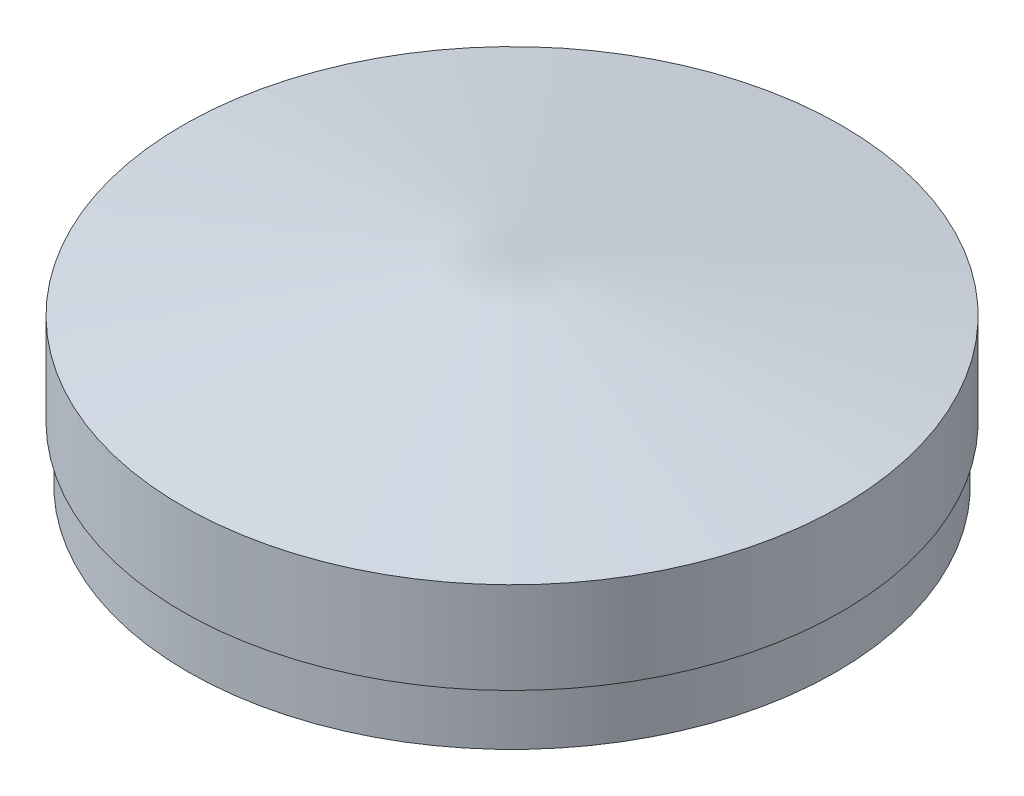
ISO-10303-21;
HEADER;
FILE_DESCRIPTION(('STEP AP214'),'2;1');
FILE_NAME('part.step','',(''),(''),'','','');
FILE_SCHEMA(('AUTOMOTIVE_DESIGN { 1 0 10303 214 1 1 1 1 }'));
ENDSEC;
DATA;
#1=APPLICATION_CONTEXT('core data for automotive mechanical design processes');
#2=APPLICATION_PROTOCOL_DEFINITION('international standard','automotive_design',2000,#1);
#3=PRODUCT_CONTEXT('',#1,'mechanical');
#4=PRODUCT('Part','Part','',(#3));
#5=PRODUCT_RELATED_PRODUCT_CATEGORY('part','',(#4));
#6=PRODUCT_DEFINITION_FORMATION('','',#4);
#7=PRODUCT_DEFINITION_CONTEXT('part definition',#1,'design');
#8=PRODUCT_DEFINITION('design','',#6,#7);
#9=PRODUCT_DEFINITION_SHAPE('','',#8);
#10=(LENGTH_UNIT() NAMED_UNIT(*) SI_UNIT(.MILLI.,.METRE.));
#11=(NAMED_UNIT(*) PLANE_ANGLE_UNIT() SI_UNIT($,.RADIAN.));
#12=(NAMED_UNIT(*) SI_UNIT($,.STERADIAN.) SOLID_ANGLE_UNIT());
#13=UNCERTAINTY_MEASURE_WITH_UNIT(LENGTH_MEASURE(1.E-05),#10,'distance_accuracy_value','');
#14=(GEOMETRIC_REPRESENTATION_CONTEXT(3) GLOBAL_UNCERTAINTY_ASSIGNED_CONTEXT((#13)) GLOBAL_UNIT_ASSIGNED_CONTEXT((#10,
#11,#12)) REPRESENTATION_CONTEXT('',''));
#15=CARTESIAN_POINT('',(0.,0.,0.));
#16=DIRECTION('',(0.,0.,1.));
#17=DIRECTION('',(1.,0.,0.));
#18=AXIS2_PLACEMENT_3D('',#15,#16,#17);
#19=CARTESIAN_POINT('',(0.,0.,0.));
#20=DIRECTION('',(0.,-1.,0.));
#21=DIRECTION('',(0.,0.,-1.));
#22=AXIS2_PLACEMENT_3D('',#19,#20,#21);
#23=CONICAL_SURFACE('',#22,18.,1.40564764938027);
#24=CARTESIAN_POINT('',(0.,3.,0.));
#25=VERTEX_POINT('',#24);
#26=VERTEX_LOOP('',#25);
#27=FACE_BOUND('',#26,.T.);
#28=CARTESIAN_POINT('',(0.,0.,0.));
#29=DIRECTION('',(0.,-1.,0.));
#30=DIRECTION('',(0.,0.,-1.));
#31=AXIS2_PLACEMENT_3D('',#28,#29,#30);
#32=CIRCLE('',#31,18.);
#33=CARTESIAN_POINT('',(0.,0.,-18.));
#34=VERTEX_POINT('',#33);
#35=EDGE_CURVE('E41',#34,#34,#32,.T.);
#36=ORIENTED_EDGE('',*,*,#35,.F.);
#37=EDGE_LOOP('',(#36));
#38=FACE_BOUND('',#37,.T.);
#39=ADVANCED_FACE('F35',(#27,#38),#23,.T.);
#40=CARTESIAN_POINT('',(0.,-5.,0.));
#41=DIRECTION('',(0.,1.,0.));
#42=DIRECTION('',(0.,0.,1.));
#43=AXIS2_PLACEMENT_3D('',#40,#41,#42);
#44=CYLINDRICAL_SURFACE('',#43,18.);
#45=CARTESIAN_POINT('',(0.,-5.,0.));
#46=DIRECTION('',(0.,-1.,0.));
#47=DIRECTION('',(0.,0.,-1.));
#48=AXIS2_PLACEMENT_3D('',#45,#46,#47);
#49=CIRCLE('',#48,18.);
#50=CARTESIAN_POINT('',(0.,-5.,-18.));
#51=VERTEX_POINT('',#50);
#52=EDGE_CURVE('E50',#51,#51,#49,.T.);
#53=ORIENTED_EDGE('',*,*,#52,.F.);
#54=EDGE_LOOP('',(#53));
#55=FACE_BOUND('',#54,.T.);
#56=ORIENTED_EDGE('',*,*,#35,.T.);
#57=EDGE_LOOP('',(#56));
#58=FACE_BOUND('',#57,.T.);
#59=ADVANCED_FACE('F46',(#55,#58),#44,.T.);
#60=CARTESIAN_POINT('',(0.,-5.,0.));
#61=DIRECTION('',(0.,-1.,0.));
#62=DIRECTION('',(0.,0.,-1.));
#63=AXIS2_PLACEMENT_3D('',#60,#61,#62);
#64=PLANE('',#63);
#65=CARTESIAN_POINT('',(0.,-5.,0.));
#66=DIRECTION('',(0.,-1.,0.));
#67=DIRECTION('',(0.,0.,-1.));
#68=AXIS2_PLACEMENT_3D('',#65,#66,#67);
#69=CIRCLE('',#68,17.7);
#70=CARTESIAN_POINT('',(0.,-5.,-17.7));
#71=VERTEX_POINT('',#70);
#72=EDGE_CURVE('E55',#71,#71,#69,.T.);
#73=ORIENTED_EDGE('',*,*,#72,.F.);
#74=EDGE_LOOP('',(#73));
#75=FACE_BOUND('',#74,.T.);
#76=ORIENTED_EDGE('',*,*,#52,.T.);
#77=EDGE_LOOP('',(#76));
#78=FACE_BOUND('',#77,.T.);
#79=ADVANCED_FACE('F104',(#75,#78),#64,.T.);
#80=CARTESIAN_POINT('',(0.,-8.,0.));
#81=DIRECTION('',(0.,-1.,0.));
#82=DIRECTION('',(0.,0.,-1.));
#83=AXIS2_PLACEMENT_3D('',#80,#81,#82);
#84=PLANE('',#83);
#85=CARTESIAN_POINT('',(0.,-8.,0.));
#86=DIRECTION('',(0.,-1.,0.));
#87=DIRECTION('',(0.,0.,-1.));
#88=AXIS2_PLACEMENT_3D('',#85,#86,#87);
#89=CIRCLE('',#88,17.7);
#90=CARTESIAN_POINT('',(0.,-8.,-17.7));
#91=VERTEX_POINT('',#90);
#92=EDGE_CURVE('E52',#91,#91,#89,.T.);
#93=ORIENTED_EDGE('',*,*,#92,.T.);
#94=EDGE_LOOP('',(#93));
#95=FACE_BOUND('',#94,.T.);
#96=CARTESIAN_POINT('',(0.,-8.,0.));
#97=DIRECTION('',(0.,-1.,0.));
#98=DIRECTION('',(0.,0.,-1.));
#99=AXIS2_PLACEMENT_3D('',#96,#97,#98);
#100=CIRCLE('',#99,16.7);
#101=CARTESIAN_POINT('',(0.,-8.,-16.7));
#102=VERTEX_POINT('',#101);
#103=EDGE_CURVE('E58',#102,#102,#100,.T.);
#104=ORIENTED_EDGE('',*,*,#103,.F.);
#105=EDGE_LOOP('',(#104));
#106=FACE_BOUND('',#105,.T.);
#107=ADVANCED_FACE('F101',(#95,#106),#84,.T.);
#108=CARTESIAN_POINT('',(0.,-8.,0.));
#109=DIRECTION('',(0.,1.,0.));
#110=DIRECTION('',(0.,0.,1.));
#111=AXIS2_PLACEMENT_3D('',#108,#109,#110);
#112=CYLINDRICAL_SURFACE('',#111,17.7);
#113=ORIENTED_EDGE('',*,*,#92,.F.);
#114=EDGE_LOOP('',(#113));
#115=FACE_BOUND('',#114,.T.);
#116=ORIENTED_EDGE('',*,*,#72,.T.);
#117=EDGE_LOOP('',(#116));
#118=FACE_BOUND('',#117,.T.);
#119=ADVANCED_FACE('F99',(#115,#118),#112,.T.);
#120=CARTESIAN_POINT('',(0.,-8.,0.));
#121=DIRECTION('',(0.,1.,0.));
#122=DIRECTION('',(0.,0.,1.));
#123=AXIS2_PLACEMENT_3D('',#120,#121,#122);
#124=CYLINDRICAL_SURFACE('',#123,16.7);
#125=ORIENTED_EDGE('',*,*,#103,.T.);
#126=EDGE_LOOP('',(#125));
#127=FACE_BOUND('',#126,.T.);
#128=CARTESIAN_POINT('',(0.,0.,0.));
#129=DIRECTION('',(0.,-1.,0.));
#130=DIRECTION('',(0.,0.,-1.));
#131=AXIS2_PLACEMENT_3D('',#128,#129,#130);
#132=CIRCLE('',#131,16.7);
#133=CARTESIAN_POINT('',(0.,0.,-16.7));
#134=VERTEX_POINT('',#133);
#135=EDGE_CURVE('E63',#134,#134,#132,.T.);
#136=ORIENTED_EDGE('',*,*,#135,.F.);
#137=EDGE_LOOP('',(#136));
#138=FACE_BOUND('',#137,.T.);
#139=ADVANCED_FACE('F91',(#127,#138),#124,.F.);
#140=CARTESIAN_POINT('',(0.,0.,0.));
#141=DIRECTION('',(0.,-1.,0.));
#142=DIRECTION('',(0.,0.,-1.));
#143=AXIS2_PLACEMENT_3D('',#140,#141,#142);
#144=PLANE('',#143);
#145=CARTESIAN_POINT('',(0.,0.,0.));
#146=DIRECTION('',(0.,-1.,0.));
#147=DIRECTION('',(0.,0.,-1.));
#148=AXIS2_PLACEMENT_3D('',#145,#146,#147);
#149=CIRCLE('',#148,2.5);
#150=CARTESIAN_POINT('',(0.,0.,-2.5));
#151=VERTEX_POINT('',#150);
#152=EDGE_CURVE('E67',#151,#151,#149,.T.);
#153=ORIENTED_EDGE('',*,*,#152,.F.);
#154=EDGE_LOOP('',(#153));
#155=FACE_BOUND('',#154,.T.);
#156=ORIENTED_EDGE('',*,*,#135,.T.);
#157=EDGE_LOOP('',(#156));
#158=FACE_BOUND('',#157,.T.);
#159=ADVANCED_FACE('F82',(#155,#158),#144,.T.);
#160=CARTESIAN_POINT('',(0.,-8.,0.));
#161=DIRECTION('',(0.,-1.,0.));
#162=DIRECTION('',(0.,0.,-1.));
#163=AXIS2_PLACEMENT_3D('',#160,#161,#162);
#164=PLANE('',#163);
#165=CARTESIAN_POINT('',(0.,-8.,0.));
#166=DIRECTION('',(0.,-1.,0.));
#167=DIRECTION('',(0.,0.,-1.));
#168=AXIS2_PLACEMENT_3D('',#165,#166,#167);
#169=CIRCLE('',#168,2.5);
#170=CARTESIAN_POINT('',(0.,-8.,-2.5));
#171=VERTEX_POINT('',#170);
#172=EDGE_CURVE('E66',#171,#171,#169,.T.);
#173=ORIENTED_EDGE('',*,*,#172,.T.);
#174=EDGE_LOOP('',(#173));
#175=FACE_BOUND('',#174,.T.);
#176=CARTESIAN_POINT('',(0.,-8.,0.));
#177=DIRECTION('',(0.,-1.,0.));
#178=DIRECTION('',(0.,0.,-1.));
#179=AXIS2_PLACEMENT_3D('',#176,#177,#178);
#180=CIRCLE('',#179,2.);
#181=CARTESIAN_POINT('',(0.,-8.,-2.));
#182=VERTEX_POINT('',#181);
#183=EDGE_CURVE('E70',#182,#182,#180,.T.);
#184=ORIENTED_EDGE('',*,*,#183,.F.);
#185=EDGE_LOOP('',(#184));
#186=FACE_BOUND('',#185,.T.);
#187=ADVANCED_FACE('F79',(#175,#186),#164,.T.);
#188=CARTESIAN_POINT('',(0.,-8.,0.));
#189=DIRECTION('',(0.,1.,0.));
#190=DIRECTION('',(0.,0.,1.));
#191=AXIS2_PLACEMENT_3D('',#188,#189,#190);
#192=CYLINDRICAL_SURFACE('',#191,2.5);
#193=ORIENTED_EDGE('',*,*,#172,.F.);
#194=EDGE_LOOP('',(#193));
#195=FACE_BOUND('',#194,.T.);
#196=ORIENTED_EDGE('',*,*,#152,.T.);
#197=EDGE_LOOP('',(#196));
#198=FACE_BOUND('',#197,.T.);
#199=ADVANCED_FACE('F81',(#195,#198),#192,.T.);
#200=CARTESIAN_POINT('',(0.,-8.,0.));
#201=DIRECTION('',(0.,1.,0.));
#202=DIRECTION('',(0.,0.,1.));
#203=AXIS2_PLACEMENT_3D('',#200,#201,#202);
#204=CYLINDRICAL_SURFACE('',#203,2.);
#205=ORIENTED_EDGE('',*,*,#183,.T.);
#206=EDGE_LOOP('',(#205));
#207=FACE_BOUND('',#206,.T.);
#208=CARTESIAN_POINT('',(0.,0.,0.));
#209=DIRECTION('',(0.,-1.,0.));
#210=DIRECTION('',(0.,0.,-1.));
#211=AXIS2_PLACEMENT_3D('',#208,#209,#210);
#212=CIRCLE('',#211,2.);
#213=CARTESIAN_POINT('',(0.,0.,-2.));
#214=VERTEX_POINT('',#213);
#215=EDGE_CURVE('E11',#214,#214,#212,.F.);
#216=ORIENTED_EDGE('',*,*,#215,.T.);
#217=EDGE_LOOP('',(#216));
#218=FACE_BOUND('',#217,.T.);
#219=ADVANCED_FACE('F76',(#207,#218),#204,.F.);
#220=ORIENTED_EDGE('',*,*,#215,.F.);
#221=EDGE_LOOP('',(#220));
#222=FACE_BOUND('',#221,.T.);
#223=ADVANCED_FACE('F94',(#222),#144,.T.);
#224=CLOSED_SHELL('',(#39,#59,#79,#107,#119,#139,#159,#187,#199,#219,#223));
#225=MANIFOLD_SOLID_BREP('B2',#224);
#226=ADVANCED_BREP_SHAPE_REPRESENTATION('',(#18,#225),#14);
#227=SHAPE_DEFINITION_REPRESENTATION(#9,#226);
ENDSEC;
END-ISO-10303-21;
